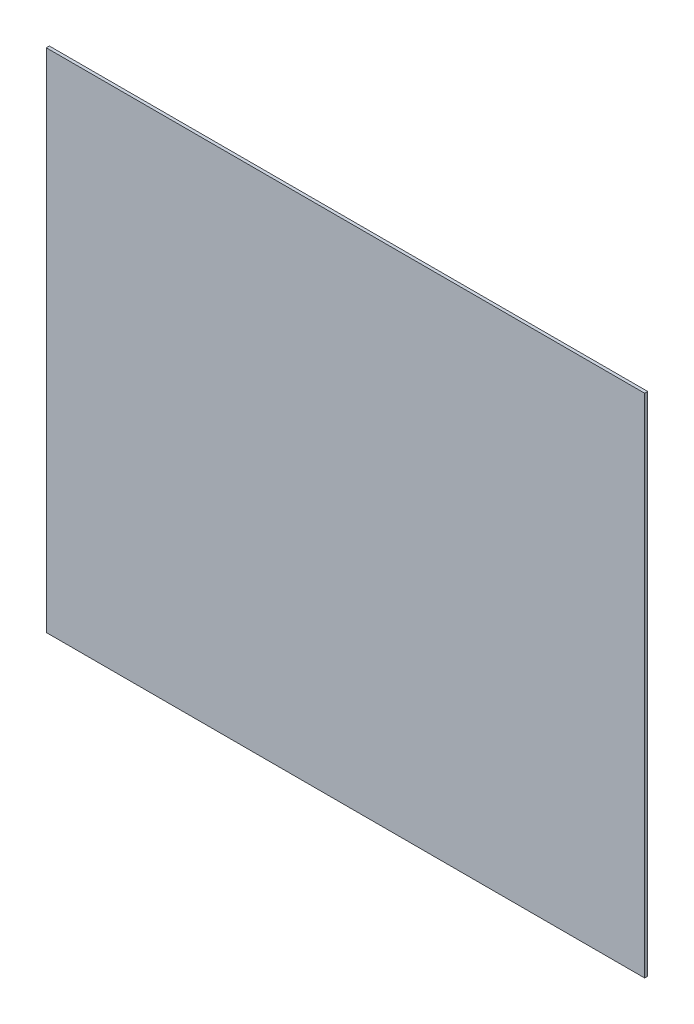
ISO-10303-21;
HEADER;
FILE_DESCRIPTION(('STEP AP214'),'2;1');
FILE_NAME('part.step','',(''),(''),'','','');
FILE_SCHEMA(('AUTOMOTIVE_DESIGN { 1 0 10303 214 1 1 1 1 }'));
ENDSEC;
DATA;
#1=APPLICATION_CONTEXT('core data for automotive mechanical design processes');
#2=APPLICATION_PROTOCOL_DEFINITION('international standard','automotive_design',2000,#1);
#3=PRODUCT_CONTEXT('',#1,'mechanical');
#4=PRODUCT('Part','Part','',(#3));
#5=PRODUCT_RELATED_PRODUCT_CATEGORY('part','',(#4));
#6=PRODUCT_DEFINITION_FORMATION('','',#4);
#7=PRODUCT_DEFINITION_CONTEXT('part definition',#1,'design');
#8=PRODUCT_DEFINITION('design','',#6,#7);
#9=PRODUCT_DEFINITION_SHAPE('','',#8);
#10=(LENGTH_UNIT() NAMED_UNIT(*) SI_UNIT(.MILLI.,.METRE.));
#11=(NAMED_UNIT(*) PLANE_ANGLE_UNIT() SI_UNIT($,.RADIAN.));
#12=(NAMED_UNIT(*) SI_UNIT($,.STERADIAN.) SOLID_ANGLE_UNIT());
#13=UNCERTAINTY_MEASURE_WITH_UNIT(LENGTH_MEASURE(1.E-05),#10,'distance_accuracy_value','');
#14=(GEOMETRIC_REPRESENTATION_CONTEXT(3) GLOBAL_UNCERTAINTY_ASSIGNED_CONTEXT((#13)) GLOBAL_UNIT_ASSIGNED_CONTEXT((#10,
#11,#12)) REPRESENTATION_CONTEXT('',''));
#15=CARTESIAN_POINT('',(0.,0.,0.));
#16=DIRECTION('',(0.,0.,1.));
#17=DIRECTION('',(1.,0.,0.));
#18=AXIS2_PLACEMENT_3D('',#15,#16,#17);
#19=CARTESIAN_POINT('',(-13.18,13.18,3.18));
#20=DIRECTION('',(1.,0.,0.));
#21=DIRECTION('',(0.,1.,0.));
#22=AXIS2_PLACEMENT_3D('',#19,#20,#21);
#23=PLANE('',#22);
#24=DIRECTION('',(0.,-1.,0.));
#25=VECTOR('',#24,1.);
#26=CARTESIAN_POINT('',(-13.18,13.18,0.));
#27=LINE('',#26,#25);
#28=CARTESIAN_POINT('',(-13.18,13.18,0.));
#29=VERTEX_POINT('',#28);
#30=CARTESIAN_POINT('',(-13.1799999999999,-511.360000000001,0.));
#31=VERTEX_POINT('',#30);
#32=EDGE_CURVE('E98',#29,#31,#27,.T.);
#33=ORIENTED_EDGE('',*,*,#32,.T.);
#34=DIRECTION('',(0.,0.,-1.));
#35=VECTOR('',#34,1.);
#36=CARTESIAN_POINT('',(-13.1799999999999,-511.360000000001,3.18));
#37=LINE('',#36,#35);
#38=CARTESIAN_POINT('',(-13.1799999999999,-511.360000000001,3.18));
#39=VERTEX_POINT('',#38);
#40=EDGE_CURVE('E11',#39,#31,#37,.T.);
#41=ORIENTED_EDGE('',*,*,#40,.F.);
#42=DIRECTION('',(0.,-1.,0.));
#43=VECTOR('',#42,1.);
#44=CARTESIAN_POINT('',(-13.18,13.18,3.18));
#45=LINE('',#44,#43);
#46=CARTESIAN_POINT('',(-13.18,13.18,3.18));
#47=VERTEX_POINT('',#46);
#48=EDGE_CURVE('E84',#47,#39,#45,.T.);
#49=ORIENTED_EDGE('',*,*,#48,.F.);
#50=DIRECTION('',(0.,0.,-1.));
#51=VECTOR('',#50,1.);
#52=CARTESIAN_POINT('',(-13.18,13.18,3.18));
#53=LINE('',#52,#51);
#54=EDGE_CURVE('E73',#47,#29,#53,.T.);
#55=ORIENTED_EDGE('',*,*,#54,.T.);
#56=EDGE_LOOP('',(#33,#41,#49,#55));
#57=FACE_BOUND('',#56,.T.);
#58=ADVANCED_FACE('F33',(#57),#23,.F.);
#59=CARTESIAN_POINT('',(438.14,-511.360000000001,3.18));
#60=DIRECTION('',(0.,1.,0.));
#61=DIRECTION('',(-1.,0.,0.));
#62=AXIS2_PLACEMENT_3D('',#59,#60,#61);
#63=PLANE('',#62);
#64=DIRECTION('',(1.,0.,0.));
#65=VECTOR('',#64,1.);
#66=CARTESIAN_POINT('',(438.14,-511.360000000001,0.));
#67=LINE('',#66,#65);
#68=CARTESIAN_POINT('',(606.526220457634,-511.360000000003,0.));
#69=VERTEX_POINT('',#68);
#70=EDGE_CURVE('E89',#31,#69,#67,.T.);
#71=ORIENTED_EDGE('',*,*,#70,.T.);
#72=DIRECTION('',(0.,0.,-1.));
#73=VECTOR('',#72,1.);
#74=CARTESIAN_POINT('',(606.526220457634,-511.360000000003,3.18));
#75=LINE('',#74,#73);
#76=CARTESIAN_POINT('',(606.526220457634,-511.360000000003,3.18));
#77=VERTEX_POINT('',#76);
#78=EDGE_CURVE('E41',#77,#69,#75,.T.);
#79=ORIENTED_EDGE('',*,*,#78,.F.);
#80=DIRECTION('',(1.,0.,0.));
#81=VECTOR('',#80,1.);
#82=CARTESIAN_POINT('',(-13.1799999999999,-511.360000000001,3.18));
#83=LINE('',#82,#81);
#84=EDGE_CURVE('E79',#39,#77,#83,.T.);
#85=ORIENTED_EDGE('',*,*,#84,.F.);
#86=ORIENTED_EDGE('',*,*,#40,.T.);
#87=EDGE_LOOP('',(#71,#79,#85,#86));
#88=FACE_BOUND('',#87,.T.);
#89=ADVANCED_FACE('F88',(#88),#63,.F.);
#90=CARTESIAN_POINT('',(606.526220457634,-511.360000000003,3.18));
#91=DIRECTION('',(-1.,0.,0.));
#92=DIRECTION('',(0.,0.,1.));
#93=AXIS2_PLACEMENT_3D('',#90,#91,#92);
#94=PLANE('',#93);
#95=DIRECTION('',(0.,1.,0.));
#96=VECTOR('',#95,1.);
#97=CARTESIAN_POINT('',(606.526220457634,-511.360000000003,0.));
#98=LINE('',#97,#96);
#99=CARTESIAN_POINT('',(606.526220457634,13.18,0.));
#100=VERTEX_POINT('',#99);
#101=EDGE_CURVE('E101',#69,#100,#98,.T.);
#102=ORIENTED_EDGE('',*,*,#101,.T.);
#103=DIRECTION('',(0.,0.,-1.));
#104=VECTOR('',#103,1.);
#105=CARTESIAN_POINT('',(606.526220457634,13.18,3.18));
#106=LINE('',#105,#104);
#107=CARTESIAN_POINT('',(606.526220457634,13.18,3.18));
#108=VERTEX_POINT('',#107);
#109=EDGE_CURVE('E91',#108,#100,#106,.T.);
#110=ORIENTED_EDGE('',*,*,#109,.F.);
#111=DIRECTION('',(0.,1.,0.));
#112=VECTOR('',#111,1.);
#113=CARTESIAN_POINT('',(606.526220457634,-511.360000000003,3.18));
#114=LINE('',#113,#112);
#115=EDGE_CURVE('E82',#77,#108,#114,.T.);
#116=ORIENTED_EDGE('',*,*,#115,.F.);
#117=ORIENTED_EDGE('',*,*,#78,.T.);
#118=EDGE_LOOP('',(#102,#110,#116,#117));
#119=FACE_BOUND('',#118,.T.);
#120=ADVANCED_FACE('F92',(#119),#94,.F.);
#121=CARTESIAN_POINT('',(-13.18,13.18,3.18));
#122=DIRECTION('',(0.,1.,0.));
#123=DIRECTION('',(0.,0.,1.));
#124=AXIS2_PLACEMENT_3D('',#121,#122,#123);
#125=PLANE('',#124);
#126=DIRECTION('',(1.,0.,0.));
#127=VECTOR('',#126,1.);
#128=CARTESIAN_POINT('',(-13.18,13.18,0.));
#129=LINE('',#128,#127);
#130=EDGE_CURVE('E66',#29,#100,#129,.T.);
#131=ORIENTED_EDGE('',*,*,#130,.F.);
#132=ORIENTED_EDGE('',*,*,#54,.F.);
#133=DIRECTION('',(-1.,0.,0.));
#134=VECTOR('',#133,1.);
#135=CARTESIAN_POINT('',(606.526220457634,13.18,3.18));
#136=LINE('',#135,#134);
#137=EDGE_CURVE('E49',#108,#47,#136,.T.);
#138=ORIENTED_EDGE('',*,*,#137,.F.);
#139=ORIENTED_EDGE('',*,*,#109,.T.);
#140=EDGE_LOOP('',(#131,#132,#138,#139));
#141=FACE_BOUND('',#140,.T.);
#142=ADVANCED_FACE('F106',(#141),#125,.T.);
#143=CARTESIAN_POINT('',(0.,0.,3.18));
#144=DIRECTION('',(0.,0.,1.));
#145=DIRECTION('',(1.,0.,0.));
#146=AXIS2_PLACEMENT_3D('',#143,#144,#145);
#147=PLANE('',#146);
#148=ORIENTED_EDGE('',*,*,#48,.T.);
#149=ORIENTED_EDGE('',*,*,#84,.T.);
#150=ORIENTED_EDGE('',*,*,#115,.T.);
#151=ORIENTED_EDGE('',*,*,#137,.T.);
#152=EDGE_LOOP('',(#148,#149,#150,#151));
#153=FACE_BOUND('',#152,.T.);
#154=ADVANCED_FACE('F80',(#153),#147,.T.);
#155=CARTESIAN_POINT('',(0.,0.,0.));
#156=DIRECTION('',(0.,0.,1.));
#157=DIRECTION('',(1.,0.,0.));
#158=AXIS2_PLACEMENT_3D('',#155,#156,#157);
#159=PLANE('',#158);
#160=ORIENTED_EDGE('',*,*,#32,.F.);
#161=ORIENTED_EDGE('',*,*,#130,.T.);
#162=ORIENTED_EDGE('',*,*,#101,.F.);
#163=ORIENTED_EDGE('',*,*,#70,.F.);
#164=EDGE_LOOP('',(#160,#161,#162,#163));
#165=FACE_BOUND('',#164,.T.);
#166=ADVANCED_FACE('F107',(#165),#159,.F.);
#167=CLOSED_SHELL('',(#58,#89,#120,#142,#154,#166));
#168=MANIFOLD_SOLID_BREP('B2',#167);
#169=ADVANCED_BREP_SHAPE_REPRESENTATION('',(#18,#168),#14);
#170=SHAPE_DEFINITION_REPRESENTATION(#9,#169);
ENDSEC;
END-ISO-10303-21;
